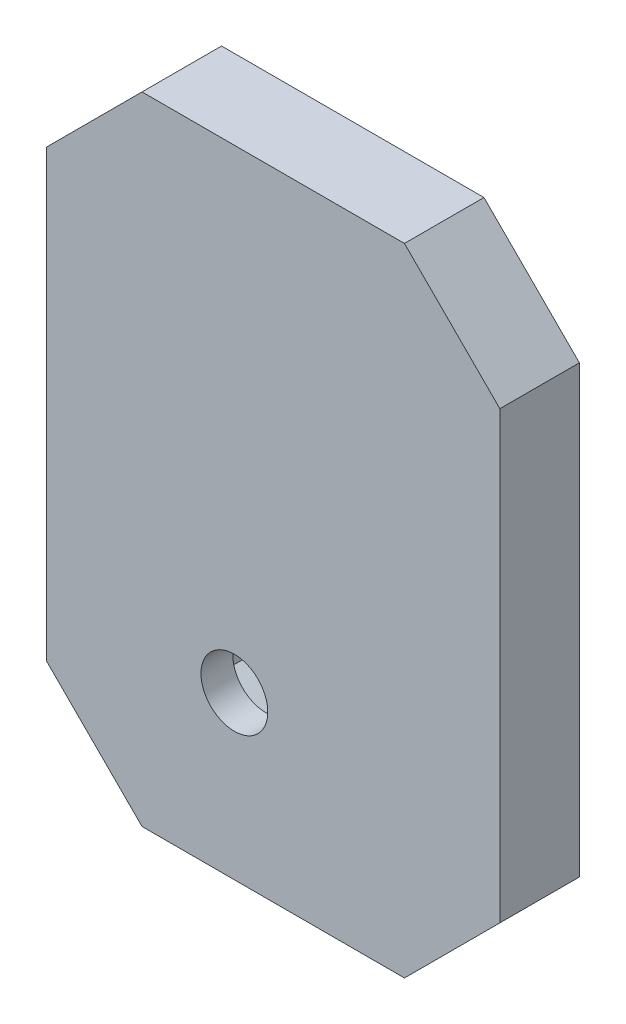
ISO-10303-21;
HEADER;
FILE_DESCRIPTION(('STEP AP214'),'2;1');
FILE_NAME('part.step','',(''),(''),'','','');
FILE_SCHEMA(('AUTOMOTIVE_DESIGN { 1 0 10303 214 1 1 1 1 }'));
ENDSEC;
DATA;
#1=APPLICATION_CONTEXT('core data for automotive mechanical design processes');
#2=APPLICATION_PROTOCOL_DEFINITION('international standard','automotive_design',2000,#1);
#3=PRODUCT_CONTEXT('',#1,'mechanical');
#4=PRODUCT('Part','Part','',(#3));
#5=PRODUCT_RELATED_PRODUCT_CATEGORY('part','',(#4));
#6=PRODUCT_DEFINITION_FORMATION('','',#4);
#7=PRODUCT_DEFINITION_CONTEXT('part definition',#1,'design');
#8=PRODUCT_DEFINITION('design','',#6,#7);
#9=PRODUCT_DEFINITION_SHAPE('','',#8);
#10=(LENGTH_UNIT() NAMED_UNIT(*) SI_UNIT(.MILLI.,.METRE.));
#11=(NAMED_UNIT(*) PLANE_ANGLE_UNIT() SI_UNIT($,.RADIAN.));
#12=(NAMED_UNIT(*) SI_UNIT($,.STERADIAN.) SOLID_ANGLE_UNIT());
#13=UNCERTAINTY_MEASURE_WITH_UNIT(LENGTH_MEASURE(1.E-05),#10,'distance_accuracy_value','');
#14=(GEOMETRIC_REPRESENTATION_CONTEXT(3) GLOBAL_UNCERTAINTY_ASSIGNED_CONTEXT((#13)) GLOBAL_UNIT_ASSIGNED_CONTEXT((#10,
#11,#12)) REPRESENTATION_CONTEXT('',''));
#15=CARTESIAN_POINT('',(0.,0.,0.));
#16=DIRECTION('',(0.,0.,1.));
#17=DIRECTION('',(1.,0.,0.));
#18=AXIS2_PLACEMENT_3D('',#15,#16,#17);
#19=CARTESIAN_POINT('',(-145.753446109695,-522.220333601552,439.620141884643));
#20=DIRECTION('',(-0.499999999999996,0.866025403784441,0.));
#21=DIRECTION('',(-0.866025403784441,-0.499999999999996,0.));
#22=AXIS2_PLACEMENT_3D('',#19,#20,#21);
#23=PLANE('',#22);
#24=DIRECTION('',(0.,0.,1.));
#25=VECTOR('',#24,1.);
#26=CARTESIAN_POINT('',(-149.403446109695,-524.327662084094,439.620141884643));
#27=LINE('',#26,#25);
#28=CARTESIAN_POINT('',(-149.403446109695,-524.327662084094,439.620141884643));
#29=VERTEX_POINT('',#28);
#30=CARTESIAN_POINT('',(-149.403446109695,-524.327662084094,442.620141884643));
#31=VERTEX_POINT('',#30);
#32=EDGE_CURVE('E156',#29,#31,#27,.T.);
#33=ORIENTED_EDGE('',*,*,#32,.T.);
#34=DIRECTION('',(0.866025403784441,0.499999999999996,0.));
#35=VECTOR('',#34,1.);
#36=CARTESIAN_POINT('',(-145.753446109695,-522.220333601552,442.620141884643));
#37=LINE('',#36,#35);
#38=CARTESIAN_POINT('',(-145.753446109695,-522.220333601552,442.620141884643));
#39=VERTEX_POINT('',#38);
#40=EDGE_CURVE('E140',#31,#39,#37,.T.);
#41=ORIENTED_EDGE('',*,*,#40,.T.);
#42=DIRECTION('',(0.,0.,1.));
#43=VECTOR('',#42,1.);
#44=CARTESIAN_POINT('',(-145.753446109695,-522.220333601552,439.620141884643));
#45=LINE('',#44,#43);
#46=CARTESIAN_POINT('',(-145.753446109695,-522.220333601552,439.620141884643));
#47=VERTEX_POINT('',#46);
#48=EDGE_CURVE('E153',#47,#39,#45,.T.);
#49=ORIENTED_EDGE('',*,*,#48,.F.);
#50=DIRECTION('',(-0.866025403784441,-0.499999999999996,0.));
#51=VECTOR('',#50,1.);
#52=CARTESIAN_POINT('',(-145.753446109695,-522.220333601552,439.620141884643));
#53=LINE('',#52,#51);
#54=EDGE_CURVE('E157',#47,#29,#53,.T.);
#55=ORIENTED_EDGE('',*,*,#54,.T.);
#56=EDGE_LOOP('',(#33,#41,#49,#55));
#57=FACE_BOUND('',#56,.T.);
#58=ADVANCED_FACE('F34',(#57),#23,.T.);
#59=CARTESIAN_POINT('',(-149.403446109695,-524.327662084094,439.620141884643));
#60=DIRECTION('',(0.499999999999985,0.866025403784447,0.));
#61=DIRECTION('',(-0.866025403784447,0.499999999999985,0.));
#62=AXIS2_PLACEMENT_3D('',#59,#60,#61);
#63=PLANE('',#62);
#64=DIRECTION('',(0.,0.,1.));
#65=VECTOR('',#64,1.);
#66=CARTESIAN_POINT('',(-153.053446109695,-522.220333601552,439.620141884643));
#67=LINE('',#66,#65);
#68=CARTESIAN_POINT('',(-153.053446109695,-522.220333601552,439.620141884643));
#69=VERTEX_POINT('',#68);
#70=CARTESIAN_POINT('',(-153.053446109695,-522.220333601552,442.620141884643));
#71=VERTEX_POINT('',#70);
#72=EDGE_CURVE('E176',#69,#71,#67,.T.);
#73=ORIENTED_EDGE('',*,*,#72,.T.);
#74=DIRECTION('',(0.866025403784447,-0.499999999999985,0.));
#75=VECTOR('',#74,1.);
#76=CARTESIAN_POINT('',(-149.403446109695,-524.327662084094,442.620141884643));
#77=LINE('',#76,#75);
#78=EDGE_CURVE('E158',#71,#31,#77,.T.);
#79=ORIENTED_EDGE('',*,*,#78,.T.);
#80=ORIENTED_EDGE('',*,*,#32,.F.);
#81=DIRECTION('',(-0.866025403784447,0.499999999999985,0.));
#82=VECTOR('',#81,1.);
#83=CARTESIAN_POINT('',(-149.403446109695,-524.327662084094,439.620141884643));
#84=LINE('',#83,#82);
#85=EDGE_CURVE('E437',#29,#69,#84,.T.);
#86=ORIENTED_EDGE('',*,*,#85,.T.);
#87=EDGE_LOOP('',(#73,#79,#80,#86));
#88=FACE_BOUND('',#87,.T.);
#89=ADVANCED_FACE('F269',(#88),#63,.T.);
#90=CARTESIAN_POINT('',(-153.053446109695,-522.220333601552,439.620141884643));
#91=DIRECTION('',(1.,0.,0.));
#92=DIRECTION('',(0.,0.,-1.));
#93=AXIS2_PLACEMENT_3D('',#90,#91,#92);
#94=PLANE('',#93);
#95=DIRECTION('',(0.,0.,1.));
#96=VECTOR('',#95,1.);
#97=CARTESIAN_POINT('',(-153.053446109695,-518.005676636468,439.620141884643));
#98=LINE('',#97,#96);
#99=CARTESIAN_POINT('',(-153.053446109695,-518.005676636468,439.620141884643));
#100=VERTEX_POINT('',#99);
#101=CARTESIAN_POINT('',(-153.053446109695,-518.005676636468,442.620141884643));
#102=VERTEX_POINT('',#101);
#103=EDGE_CURVE('E173',#100,#102,#98,.T.);
#104=ORIENTED_EDGE('',*,*,#103,.T.);
#105=DIRECTION('',(0.,-1.,0.));
#106=VECTOR('',#105,1.);
#107=CARTESIAN_POINT('',(-153.053446109695,-522.220333601552,442.620141884643));
#108=LINE('',#107,#106);
#109=EDGE_CURVE('E448',#102,#71,#108,.T.);
#110=ORIENTED_EDGE('',*,*,#109,.T.);
#111=ORIENTED_EDGE('',*,*,#72,.F.);
#112=DIRECTION('',(0.,1.,0.));
#113=VECTOR('',#112,1.);
#114=CARTESIAN_POINT('',(-153.053446109695,-522.220333601552,439.620141884643));
#115=LINE('',#114,#113);
#116=EDGE_CURVE('E439',#69,#100,#115,.T.);
#117=ORIENTED_EDGE('',*,*,#116,.T.);
#118=EDGE_LOOP('',(#104,#110,#111,#117));
#119=FACE_BOUND('',#118,.T.);
#120=ADVANCED_FACE('F274',(#119),#94,.T.);
#121=CARTESIAN_POINT('',(-153.053446109695,-518.005676636468,439.620141884643));
#122=DIRECTION('',(0.499999999999999,-0.866025403784439,0.));
#123=DIRECTION('',(0.866025403784439,0.499999999999999,0.));
#124=AXIS2_PLACEMENT_3D('',#121,#122,#123);
#125=PLANE('',#124);
#126=DIRECTION('',(0.,0.,1.));
#127=VECTOR('',#126,1.);
#128=CARTESIAN_POINT('',(-149.403446109694,-515.898348153926,439.620141884643));
#129=LINE('',#128,#127);
#130=CARTESIAN_POINT('',(-149.403446109694,-515.898348153926,439.620141884643));
#131=VERTEX_POINT('',#130);
#132=CARTESIAN_POINT('',(-149.403446109694,-515.898348153926,442.620141884643));
#133=VERTEX_POINT('',#132);
#134=EDGE_CURVE('E165',#131,#133,#129,.T.);
#135=ORIENTED_EDGE('',*,*,#134,.T.);
#136=DIRECTION('',(-0.866025403784439,-0.499999999999999,0.));
#137=VECTOR('',#136,1.);
#138=CARTESIAN_POINT('',(-153.053446109695,-518.005676636468,442.620141884643));
#139=LINE('',#138,#137);
#140=EDGE_CURVE('E449',#133,#102,#139,.T.);
#141=ORIENTED_EDGE('',*,*,#140,.T.);
#142=ORIENTED_EDGE('',*,*,#103,.F.);
#143=DIRECTION('',(0.866025403784439,0.499999999999999,0.));
#144=VECTOR('',#143,1.);
#145=CARTESIAN_POINT('',(-153.053446109695,-518.005676636468,439.620141884643));
#146=LINE('',#145,#144);
#147=EDGE_CURVE('E434',#100,#131,#146,.T.);
#148=ORIENTED_EDGE('',*,*,#147,.T.);
#149=EDGE_LOOP('',(#135,#141,#142,#148));
#150=FACE_BOUND('',#149,.T.);
#151=ADVANCED_FACE('F372',(#150),#125,.T.);
#152=CARTESIAN_POINT('',(-149.403446109694,-515.898348153926,439.620141884643));
#153=DIRECTION('',(-0.500000000000002,-0.866025403784437,0.));
#154=DIRECTION('',(0.866025403784437,-0.500000000000002,0.));
#155=AXIS2_PLACEMENT_3D('',#152,#153,#154);
#156=PLANE('',#155);
#157=DIRECTION('',(0.,0.,1.));
#158=VECTOR('',#157,1.);
#159=CARTESIAN_POINT('',(-145.753446109695,-518.005676636468,439.620141884643));
#160=LINE('',#159,#158);
#161=CARTESIAN_POINT('',(-145.753446109695,-518.005676636468,439.620141884643));
#162=VERTEX_POINT('',#161);
#163=CARTESIAN_POINT('',(-145.753446109695,-518.005676636468,442.620141884643));
#164=VERTEX_POINT('',#163);
#165=EDGE_CURVE('E163',#162,#164,#160,.T.);
#166=ORIENTED_EDGE('',*,*,#165,.T.);
#167=DIRECTION('',(-0.866025403784437,0.500000000000002,0.));
#168=VECTOR('',#167,1.);
#169=CARTESIAN_POINT('',(-149.403446109694,-515.898348153926,442.620141884643));
#170=LINE('',#169,#168);
#171=EDGE_CURVE('E143',#164,#133,#170,.T.);
#172=ORIENTED_EDGE('',*,*,#171,.T.);
#173=ORIENTED_EDGE('',*,*,#134,.F.);
#174=DIRECTION('',(0.866025403784437,-0.500000000000002,0.));
#175=VECTOR('',#174,1.);
#176=CARTESIAN_POINT('',(-149.403446109694,-515.898348153926,439.620141884643));
#177=LINE('',#176,#175);
#178=EDGE_CURVE('E167',#131,#162,#177,.T.);
#179=ORIENTED_EDGE('',*,*,#178,.T.);
#180=EDGE_LOOP('',(#166,#172,#173,#179));
#181=FACE_BOUND('',#180,.T.);
#182=ADVANCED_FACE('F380',(#181),#156,.T.);
#183=CARTESIAN_POINT('',(-145.753446109695,-518.005676636468,439.620141884643));
#184=DIRECTION('',(-1.,0.,0.));
#185=DIRECTION('',(0.,0.,1.));
#186=AXIS2_PLACEMENT_3D('',#183,#184,#185);
#187=PLANE('',#186);
#188=ORIENTED_EDGE('',*,*,#48,.T.);
#189=DIRECTION('',(0.,1.,0.));
#190=VECTOR('',#189,1.);
#191=CARTESIAN_POINT('',(-145.753446109695,-518.005676636468,442.620141884643));
#192=LINE('',#191,#190);
#193=EDGE_CURVE('E136',#39,#164,#192,.T.);
#194=ORIENTED_EDGE('',*,*,#193,.T.);
#195=ORIENTED_EDGE('',*,*,#165,.F.);
#196=DIRECTION('',(0.,-1.,0.));
#197=VECTOR('',#196,1.);
#198=CARTESIAN_POINT('',(-145.753446109695,-518.005676636468,439.620141884643));
#199=LINE('',#198,#197);
#200=EDGE_CURVE('E162',#162,#47,#199,.T.);
#201=ORIENTED_EDGE('',*,*,#200,.T.);
#202=EDGE_LOOP('',(#188,#194,#195,#201));
#203=FACE_BOUND('',#202,.T.);
#204=ADVANCED_FACE('F160',(#203),#187,.T.);
#205=CARTESIAN_POINT('',(0.,0.,439.620141884643));
#206=DIRECTION('',(0.,0.,1.));
#207=DIRECTION('',(1.,0.,0.));
#208=AXIS2_PLACEMENT_3D('',#205,#206,#207);
#209=PLANE('',#208);
#210=DIRECTION('',(0.,1.,0.));
#211=VECTOR('',#210,1.);
#212=CARTESIAN_POINT('',(-161.210843613703,-490.298939869288,439.620141884643));
#213=LINE('',#212,#211);
#214=CARTESIAN_POINT('',(-161.210843613703,-524.298939869288,439.620141884643));
#215=VERTEX_POINT('',#214);
#216=CARTESIAN_POINT('',(-161.210843613703,-496.298939869289,439.620141884643));
#217=VERTEX_POINT('',#216);
#218=EDGE_CURVE('E181',#215,#217,#213,.T.);
#219=ORIENTED_EDGE('',*,*,#218,.T.);
#220=DIRECTION('',(-0.707106781186546,-0.707106781186549,0.));
#221=VECTOR('',#220,1.);
#222=CARTESIAN_POINT('',(-155.210843613703,-490.298939869288,439.620141884643));
#223=LINE('',#222,#221);
#224=CARTESIAN_POINT('',(-155.210843613703,-490.298939869288,439.620141884643));
#225=VERTEX_POINT('',#224);
#226=EDGE_CURVE('E222',#217,#225,#223,.F.);
#227=ORIENTED_EDGE('',*,*,#226,.T.);
#228=DIRECTION('',(1.,0.,0.));
#229=VECTOR('',#228,1.);
#230=CARTESIAN_POINT('',(-161.210843613703,-490.298939869288,439.620141884643));
#231=LINE('',#230,#229);
#232=CARTESIAN_POINT('',(-138.710843613696,-490.298939869288,439.620141884643));
#233=VERTEX_POINT('',#232);
#234=EDGE_CURVE('E184',#225,#233,#231,.T.);
#235=ORIENTED_EDGE('',*,*,#234,.T.);
#236=DIRECTION('',(-0.707106781186546,0.707106781186549,0.));
#237=VECTOR('',#236,1.);
#238=CARTESIAN_POINT('',(-132.710843613696,-496.298939869288,439.620141884643));
#239=LINE('',#238,#237);
#240=CARTESIAN_POINT('',(-132.710843613696,-496.298939869288,439.620141884643));
#241=VERTEX_POINT('',#240);
#242=EDGE_CURVE('E217',#233,#241,#239,.F.);
#243=ORIENTED_EDGE('',*,*,#242,.T.);
#244=DIRECTION('',(0.,-1.,0.));
#245=VECTOR('',#244,1.);
#246=CARTESIAN_POINT('',(-132.710843613696,-490.298939869288,439.620141884643));
#247=LINE('',#246,#245);
#248=CARTESIAN_POINT('',(-132.710843613696,-524.298939869288,439.620141884643));
#249=VERTEX_POINT('',#248);
#250=EDGE_CURVE('E188',#241,#249,#247,.T.);
#251=ORIENTED_EDGE('',*,*,#250,.T.);
#252=DIRECTION('',(0.707106781186546,0.707106781186549,0.));
#253=VECTOR('',#252,1.);
#254=CARTESIAN_POINT('',(-138.710843613696,-530.298939869288,439.620141884643));
#255=LINE('',#254,#253);
#256=CARTESIAN_POINT('',(-138.710843613696,-530.298939869288,439.620141884643));
#257=VERTEX_POINT('',#256);
#258=EDGE_CURVE('E57',#249,#257,#255,.F.);
#259=ORIENTED_EDGE('',*,*,#258,.T.);
#260=DIRECTION('',(-1.,0.,0.));
#261=VECTOR('',#260,1.);
#262=CARTESIAN_POINT('',(-161.210843613703,-530.298939869288,439.620141884643));
#263=LINE('',#262,#261);
#264=CARTESIAN_POINT('',(-155.210843613703,-530.298939869288,439.620141884643));
#265=VERTEX_POINT('',#264);
#266=EDGE_CURVE('E148',#257,#265,#263,.T.);
#267=ORIENTED_EDGE('',*,*,#266,.T.);
#268=DIRECTION('',(0.707106781186546,-0.707106781186549,0.));
#269=VECTOR('',#268,1.);
#270=CARTESIAN_POINT('',(-161.210843613703,-524.298939869288,439.620141884643));
#271=LINE('',#270,#269);
#272=EDGE_CURVE('E220',#265,#215,#271,.F.);
#273=ORIENTED_EDGE('',*,*,#272,.T.);
#274=EDGE_LOOP('',(#219,#227,#235,#243,#251,#259,#267,#273));
#275=FACE_BOUND('',#274,.T.);
#276=ORIENTED_EDGE('',*,*,#54,.F.);
#277=ORIENTED_EDGE('',*,*,#200,.F.);
#278=ORIENTED_EDGE('',*,*,#178,.F.);
#279=ORIENTED_EDGE('',*,*,#147,.F.);
#280=ORIENTED_EDGE('',*,*,#116,.F.);
#281=ORIENTED_EDGE('',*,*,#85,.F.);
#282=EDGE_LOOP('',(#276,#277,#278,#279,#280,#281));
#283=FACE_BOUND('',#282,.T.);
#284=ADVANCED_FACE('F246',(#275,#283),#209,.F.);
#285=CARTESIAN_POINT('',(0.,0.,444.620141884643));
#286=DIRECTION('',(0.,0.,1.));
#287=DIRECTION('',(1.,0.,0.));
#288=AXIS2_PLACEMENT_3D('',#285,#286,#287);
#289=PLANE('',#288);
#290=DIRECTION('',(1.,0.,0.));
#291=VECTOR('',#290,1.);
#292=CARTESIAN_POINT('',(-161.210843613703,-490.298939869288,444.620141884643));
#293=LINE('',#292,#291);
#294=CARTESIAN_POINT('',(-155.210843613703,-490.298939869288,444.620141884643));
#295=VERTEX_POINT('',#294);
#296=CARTESIAN_POINT('',(-138.710843613696,-490.298939869288,444.620141884643));
#297=VERTEX_POINT('',#296);
#298=EDGE_CURVE('E193',#295,#297,#293,.T.);
#299=ORIENTED_EDGE('',*,*,#298,.F.);
#300=DIRECTION('',(0.707106781186546,0.707106781186549,0.));
#301=VECTOR('',#300,1.);
#302=CARTESIAN_POINT('',(167.544048127792,-167.544048127792,444.620141884643));
#303=LINE('',#302,#301);
#304=CARTESIAN_POINT('',(-161.210843613703,-496.298939869289,444.620141884643));
#305=VERTEX_POINT('',#304);
#306=EDGE_CURVE('E210',#295,#305,#303,.F.);
#307=ORIENTED_EDGE('',*,*,#306,.T.);
#308=DIRECTION('',(0.,1.,0.));
#309=VECTOR('',#308,1.);
#310=CARTESIAN_POINT('',(-161.210843613703,-490.298939869288,444.620141884643));
#311=LINE('',#310,#309);
#312=CARTESIAN_POINT('',(-161.210843613703,-524.298939869288,444.620141884643));
#313=VERTEX_POINT('',#312);
#314=EDGE_CURVE('E180',#313,#305,#311,.T.);
#315=ORIENTED_EDGE('',*,*,#314,.F.);
#316=DIRECTION('',(-0.707106781186546,0.707106781186549,0.));
#317=VECTOR('',#316,1.);
#318=CARTESIAN_POINT('',(-342.754891741496,-342.754891741495,444.620141884643));
#319=LINE('',#318,#317);
#320=CARTESIAN_POINT('',(-155.210843613703,-530.298939869288,444.620141884643));
#321=VERTEX_POINT('',#320);
#322=EDGE_CURVE('E208',#313,#321,#319,.F.);
#323=ORIENTED_EDGE('',*,*,#322,.T.);
#324=DIRECTION('',(-1.,0.,0.));
#325=VECTOR('',#324,1.);
#326=CARTESIAN_POINT('',(-161.210843613703,-530.298939869288,444.620141884643));
#327=LINE('',#326,#325);
#328=CARTESIAN_POINT('',(-138.710843613696,-530.298939869288,444.620141884643));
#329=VERTEX_POINT('',#328);
#330=EDGE_CURVE('E185',#329,#321,#327,.T.);
#331=ORIENTED_EDGE('',*,*,#330,.F.);
#332=DIRECTION('',(-0.707106781186546,-0.707106781186549,0.));
#333=VECTOR('',#332,1.);
#334=CARTESIAN_POINT('',(195.794048127796,-195.794048127795,444.620141884643));
#335=LINE('',#334,#333);
#336=CARTESIAN_POINT('',(-132.710843613696,-524.298939869288,444.620141884643));
#337=VERTEX_POINT('',#336);
#338=EDGE_CURVE('E206',#329,#337,#335,.F.);
#339=ORIENTED_EDGE('',*,*,#338,.T.);
#340=DIRECTION('',(0.,-1.,0.));
#341=VECTOR('',#340,1.);
#342=CARTESIAN_POINT('',(-132.710843613696,-490.298939869288,444.620141884643));
#343=LINE('',#342,#341);
#344=CARTESIAN_POINT('',(-132.710843613696,-496.298939869288,444.620141884643));
#345=VERTEX_POINT('',#344);
#346=EDGE_CURVE('E196',#345,#337,#343,.T.);
#347=ORIENTED_EDGE('',*,*,#346,.F.);
#348=DIRECTION('',(0.707106781186546,-0.707106781186549,0.));
#349=VECTOR('',#348,1.);
#350=CARTESIAN_POINT('',(-314.504891741493,-314.504891741491,444.620141884643));
#351=LINE('',#350,#349);
#352=EDGE_CURVE('E204',#345,#297,#351,.F.);
#353=ORIENTED_EDGE('',*,*,#352,.T.);
#354=EDGE_LOOP('',(#299,#307,#315,#323,#331,#339,#347,#353));
#355=FACE_BOUND('',#354,.T.);
#356=CARTESIAN_POINT('',(-149.403446109703,-520.113005119012,444.620141884643));
#357=DIRECTION('',(0.,0.,-1.));
#358=DIRECTION('',(-1.,0.,0.));
#359=AXIS2_PLACEMENT_3D('',#356,#357,#358);
#360=CIRCLE('',#359,2.1);
#361=CARTESIAN_POINT('',(-151.503446109703,-520.113005119012,444.620141884643));
#362=VERTEX_POINT('',#361);
#363=EDGE_CURVE('E455',#362,#362,#360,.T.);
#364=ORIENTED_EDGE('',*,*,#363,.T.);
#365=EDGE_LOOP('',(#364));
#366=FACE_BOUND('',#365,.T.);
#367=ADVANCED_FACE('F238',(#355,#366),#289,.T.);
#368=CARTESIAN_POINT('',(-161.210843613703,-490.298939869288,439.620141884643));
#369=DIRECTION('',(1.,0.,0.));
#370=DIRECTION('',(0.,1.,0.));
#371=AXIS2_PLACEMENT_3D('',#368,#369,#370);
#372=PLANE('',#371);
#373=ORIENTED_EDGE('',*,*,#314,.T.);
#374=DIRECTION('',(0.,0.,-1.));
#375=VECTOR('',#374,1.);
#376=CARTESIAN_POINT('',(-161.210843613703,-496.298939869289,439.620141884643));
#377=LINE('',#376,#375);
#378=EDGE_CURVE('E215',#305,#217,#377,.T.);
#379=ORIENTED_EDGE('',*,*,#378,.T.);
#380=ORIENTED_EDGE('',*,*,#218,.F.);
#381=DIRECTION('',(0.,0.,1.));
#382=VECTOR('',#381,1.);
#383=CARTESIAN_POINT('',(-161.210843613703,-524.298939869288,439.620141884643));
#384=LINE('',#383,#382);
#385=EDGE_CURVE('E212',#215,#313,#384,.T.);
#386=ORIENTED_EDGE('',*,*,#385,.T.);
#387=EDGE_LOOP('',(#373,#379,#380,#386));
#388=FACE_BOUND('',#387,.T.);
#389=ADVANCED_FACE('F254',(#388),#372,.F.);
#390=CARTESIAN_POINT('',(-161.210843613703,-490.298939869288,439.620141884643));
#391=DIRECTION('',(0.,-1.,0.));
#392=DIRECTION('',(0.,0.,-1.));
#393=AXIS2_PLACEMENT_3D('',#390,#391,#392);
#394=PLANE('',#393);
#395=ORIENTED_EDGE('',*,*,#234,.F.);
#396=DIRECTION('',(0.,0.,1.));
#397=VECTOR('',#396,1.);
#398=CARTESIAN_POINT('',(-155.210843613703,-490.298939869288,439.620141884643));
#399=LINE('',#398,#397);
#400=EDGE_CURVE('E201',#225,#295,#399,.T.);
#401=ORIENTED_EDGE('',*,*,#400,.T.);
#402=ORIENTED_EDGE('',*,*,#298,.T.);
#403=DIRECTION('',(0.,0.,-1.));
#404=VECTOR('',#403,1.);
#405=CARTESIAN_POINT('',(-138.710843613696,-490.298939869288,439.620141884643));
#406=LINE('',#405,#404);
#407=EDGE_CURVE('E147',#297,#233,#406,.T.);
#408=ORIENTED_EDGE('',*,*,#407,.T.);
#409=EDGE_LOOP('',(#395,#401,#402,#408));
#410=FACE_BOUND('',#409,.T.);
#411=ADVANCED_FACE('F262',(#410),#394,.F.);
#412=CARTESIAN_POINT('',(-132.710843613696,-490.298939869288,439.620141884643));
#413=DIRECTION('',(-1.,0.,0.));
#414=DIRECTION('',(0.,0.,1.));
#415=AXIS2_PLACEMENT_3D('',#412,#413,#414);
#416=PLANE('',#415);
#417=ORIENTED_EDGE('',*,*,#346,.T.);
#418=DIRECTION('',(0.,0.,-1.));
#419=VECTOR('',#418,1.);
#420=CARTESIAN_POINT('',(-132.710843613696,-524.298939869288,439.620141884643));
#421=LINE('',#420,#419);
#422=EDGE_CURVE('E11',#337,#249,#421,.T.);
#423=ORIENTED_EDGE('',*,*,#422,.T.);
#424=ORIENTED_EDGE('',*,*,#250,.F.);
#425=DIRECTION('',(0.,0.,1.));
#426=VECTOR('',#425,1.);
#427=CARTESIAN_POINT('',(-132.710843613696,-496.298939869288,439.620141884643));
#428=LINE('',#427,#426);
#429=EDGE_CURVE('E43',#241,#345,#428,.T.);
#430=ORIENTED_EDGE('',*,*,#429,.T.);
#431=EDGE_LOOP('',(#417,#423,#424,#430));
#432=FACE_BOUND('',#431,.T.);
#433=ADVANCED_FACE('F232',(#432),#416,.F.);
#434=CARTESIAN_POINT('',(-161.210843613703,-530.298939869288,439.620141884643));
#435=DIRECTION('',(0.,1.,0.));
#436=DIRECTION('',(0.,0.,1.));
#437=AXIS2_PLACEMENT_3D('',#434,#435,#436);
#438=PLANE('',#437);
#439=ORIENTED_EDGE('',*,*,#330,.T.);
#440=DIRECTION('',(0.,0.,-1.));
#441=VECTOR('',#440,1.);
#442=CARTESIAN_POINT('',(-155.210843613703,-530.298939869288,439.620141884643));
#443=LINE('',#442,#441);
#444=EDGE_CURVE('E50',#321,#265,#443,.T.);
#445=ORIENTED_EDGE('',*,*,#444,.T.);
#446=ORIENTED_EDGE('',*,*,#266,.F.);
#447=DIRECTION('',(0.,0.,1.));
#448=VECTOR('',#447,1.);
#449=CARTESIAN_POINT('',(-138.710843613696,-530.298939869288,439.620141884643));
#450=LINE('',#449,#448);
#451=EDGE_CURVE('E224',#257,#329,#450,.T.);
#452=ORIENTED_EDGE('',*,*,#451,.T.);
#453=EDGE_LOOP('',(#439,#445,#446,#452));
#454=FACE_BOUND('',#453,.T.);
#455=ADVANCED_FACE('F244',(#454),#438,.F.);
#456=CARTESIAN_POINT('',(0.,0.,442.620141884643));
#457=DIRECTION('',(0.,0.,1.));
#458=DIRECTION('',(1.,0.,0.));
#459=AXIS2_PLACEMENT_3D('',#456,#457,#458);
#460=PLANE('',#459);
#461=ORIENTED_EDGE('',*,*,#40,.F.);
#462=ORIENTED_EDGE('',*,*,#78,.F.);
#463=ORIENTED_EDGE('',*,*,#109,.F.);
#464=ORIENTED_EDGE('',*,*,#140,.F.);
#465=ORIENTED_EDGE('',*,*,#171,.F.);
#466=ORIENTED_EDGE('',*,*,#193,.F.);
#467=EDGE_LOOP('',(#461,#462,#463,#464,#465,#466));
#468=FACE_BOUND('',#467,.T.);
#469=CARTESIAN_POINT('',(-149.403446109703,-520.113005119012,442.620141884643));
#470=DIRECTION('',(0.,0.,-1.));
#471=DIRECTION('',(-1.,0.,0.));
#472=AXIS2_PLACEMENT_3D('',#469,#470,#471);
#473=CIRCLE('',#472,2.1);
#474=CARTESIAN_POINT('',(-151.503446109703,-520.113005119012,442.620141884643));
#475=VERTEX_POINT('',#474);
#476=EDGE_CURVE('E454',#475,#475,#473,.T.);
#477=ORIENTED_EDGE('',*,*,#476,.F.);
#478=EDGE_LOOP('',(#477));
#479=FACE_BOUND('',#478,.T.);
#480=ADVANCED_FACE('F138',(#468,#479),#460,.F.);
#481=CARTESIAN_POINT('',(-149.403446109703,-520.113005119012,442.620141884643));
#482=DIRECTION('',(0.,0.,1.));
#483=DIRECTION('',(1.,0.,0.));
#484=AXIS2_PLACEMENT_3D('',#481,#482,#483);
#485=CYLINDRICAL_SURFACE('',#484,2.1);
#486=ORIENTED_EDGE('',*,*,#476,.T.);
#487=EDGE_LOOP('',(#486));
#488=FACE_BOUND('',#487,.T.);
#489=ORIENTED_EDGE('',*,*,#363,.F.);
#490=EDGE_LOOP('',(#489));
#491=FACE_BOUND('',#490,.T.);
#492=ADVANCED_FACE('F297',(#488,#491),#485,.F.);
#493=CARTESIAN_POINT('',(-155.210843613703,-490.298939869288,439.620141884643));
#494=DIRECTION('',(0.707106781186549,-0.707106781186546,0.));
#495=DIRECTION('',(0.,0.,1.));
#496=AXIS2_PLACEMENT_3D('',#493,#494,#495);
#497=PLANE('',#496);
#498=ORIENTED_EDGE('',*,*,#226,.F.);
#499=ORIENTED_EDGE('',*,*,#378,.F.);
#500=ORIENTED_EDGE('',*,*,#306,.F.);
#501=ORIENTED_EDGE('',*,*,#400,.F.);
#502=EDGE_LOOP('',(#498,#499,#500,#501));
#503=FACE_BOUND('',#502,.T.);
#504=ADVANCED_FACE('F259',(#503),#497,.F.);
#505=CARTESIAN_POINT('',(-161.210843613703,-524.298939869288,439.620141884643));
#506=DIRECTION('',(0.707106781186549,0.707106781186546,0.));
#507=DIRECTION('',(0.,0.,1.));
#508=AXIS2_PLACEMENT_3D('',#505,#506,#507);
#509=PLANE('',#508);
#510=ORIENTED_EDGE('',*,*,#272,.F.);
#511=ORIENTED_EDGE('',*,*,#444,.F.);
#512=ORIENTED_EDGE('',*,*,#322,.F.);
#513=ORIENTED_EDGE('',*,*,#385,.F.);
#514=EDGE_LOOP('',(#510,#511,#512,#513));
#515=FACE_BOUND('',#514,.T.);
#516=ADVANCED_FACE('F251',(#515),#509,.F.);
#517=CARTESIAN_POINT('',(-138.710843613696,-530.298939869288,439.620141884643));
#518=DIRECTION('',(-0.707106781186549,0.707106781186546,0.));
#519=DIRECTION('',(0.,0.,1.));
#520=AXIS2_PLACEMENT_3D('',#517,#518,#519);
#521=PLANE('',#520);
#522=ORIENTED_EDGE('',*,*,#258,.F.);
#523=ORIENTED_EDGE('',*,*,#422,.F.);
#524=ORIENTED_EDGE('',*,*,#338,.F.);
#525=ORIENTED_EDGE('',*,*,#451,.F.);
#526=EDGE_LOOP('',(#522,#523,#524,#525));
#527=FACE_BOUND('',#526,.T.);
#528=ADVANCED_FACE('F243',(#527),#521,.F.);
#529=CARTESIAN_POINT('',(-132.710843613696,-496.298939869288,439.620141884643));
#530=DIRECTION('',(-0.707106781186549,-0.707106781186546,0.));
#531=DIRECTION('',(0.,0.,1.));
#532=AXIS2_PLACEMENT_3D('',#529,#530,#531);
#533=PLANE('',#532);
#534=ORIENTED_EDGE('',*,*,#242,.F.);
#535=ORIENTED_EDGE('',*,*,#407,.F.);
#536=ORIENTED_EDGE('',*,*,#352,.F.);
#537=ORIENTED_EDGE('',*,*,#429,.F.);
#538=EDGE_LOOP('',(#534,#535,#536,#537));
#539=FACE_BOUND('',#538,.T.);
#540=ADVANCED_FACE('F37',(#539),#533,.F.);
#541=CLOSED_SHELL('',(#58,#89,#120,#151,#182,#204,#284,#367,#389,#411,#433,#455,#480,#492,#504,
#516,#528,#540));
#542=MANIFOLD_SOLID_BREP('B2',#541);
#543=ADVANCED_BREP_SHAPE_REPRESENTATION('',(#18,#542),#14);
#544=SHAPE_DEFINITION_REPRESENTATION(#9,#543);
ENDSEC;
END-ISO-10303-21;
